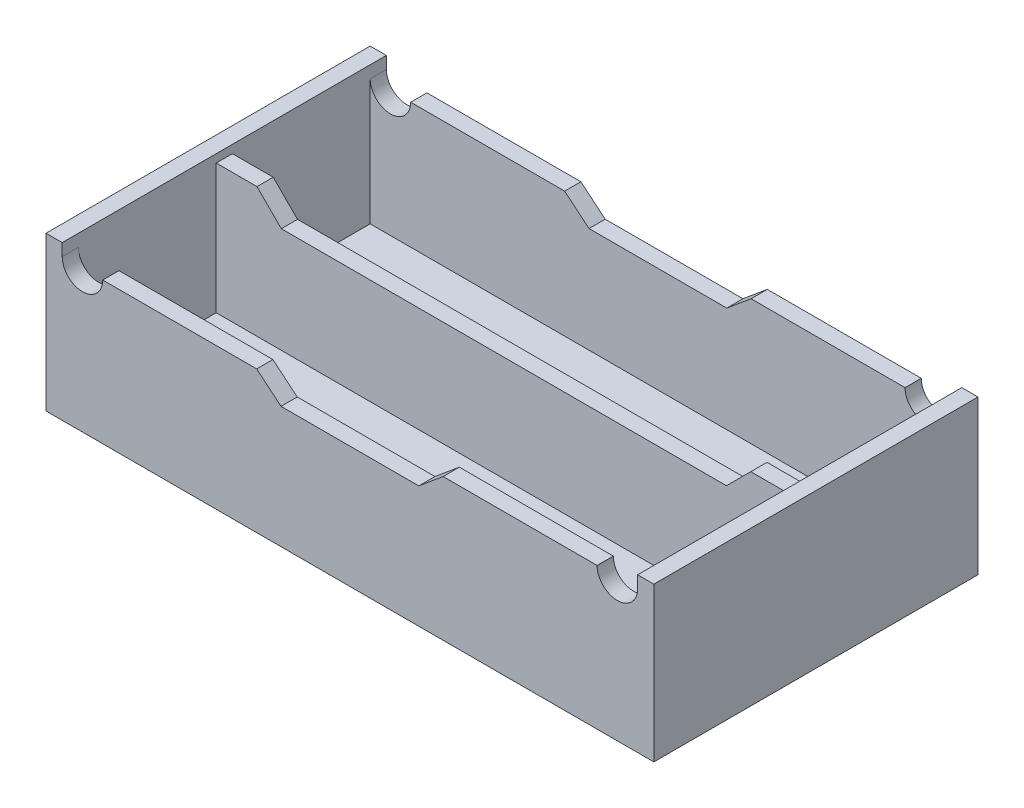
ISO-10303-21;
HEADER;
FILE_DESCRIPTION(('STEP AP214'),'2;1');
FILE_NAME('part.step','',(''),(''),'','','');
FILE_SCHEMA(('AUTOMOTIVE_DESIGN { 1 0 10303 214 1 1 1 1 }'));
ENDSEC;
DATA;
#1=APPLICATION_CONTEXT('core data for automotive mechanical design processes');
#2=APPLICATION_PROTOCOL_DEFINITION('international standard','automotive_design',2000,#1);
#3=PRODUCT_CONTEXT('',#1,'mechanical');
#4=PRODUCT('Part','Part','',(#3));
#5=PRODUCT_RELATED_PRODUCT_CATEGORY('part','',(#4));
#6=PRODUCT_DEFINITION_FORMATION('','',#4);
#7=PRODUCT_DEFINITION_CONTEXT('part definition',#1,'design');
#8=PRODUCT_DEFINITION('design','',#6,#7);
#9=PRODUCT_DEFINITION_SHAPE('','',#8);
#10=(LENGTH_UNIT() NAMED_UNIT(*) SI_UNIT(.MILLI.,.METRE.));
#11=(NAMED_UNIT(*) PLANE_ANGLE_UNIT() SI_UNIT($,.RADIAN.));
#12=(NAMED_UNIT(*) SI_UNIT($,.STERADIAN.) SOLID_ANGLE_UNIT());
#13=UNCERTAINTY_MEASURE_WITH_UNIT(LENGTH_MEASURE(1.E-05),#10,'distance_accuracy_value','');
#14=(GEOMETRIC_REPRESENTATION_CONTEXT(3) GLOBAL_UNCERTAINTY_ASSIGNED_CONTEXT((#13)) GLOBAL_UNIT_ASSIGNED_CONTEXT((#10,
#11,#12)) REPRESENTATION_CONTEXT('',''));
#15=CARTESIAN_POINT('',(0.,0.,0.));
#16=DIRECTION('',(0.,0.,1.));
#17=DIRECTION('',(1.,0.,0.));
#18=AXIS2_PLACEMENT_3D('',#15,#16,#17);
#19=CARTESIAN_POINT('',(0.,19.,0.));
#20=DIRECTION('',(0.,1.,0.));
#21=DIRECTION('',(0.,0.,1.));
#22=AXIS2_PLACEMENT_3D('',#19,#20,#21);
#23=PLANE('',#22);
#24=DIRECTION('',(0.,0.,-1.));
#25=VECTOR('',#24,1.);
#26=CARTESIAN_POINT('',(73.,19.,-38.));
#27=LINE('',#26,#25);
#28=CARTESIAN_POINT('',(73.,19.,0.));
#29=VERTEX_POINT('',#28);
#30=CARTESIAN_POINT('',(73.,19.,-40.));
#31=VERTEX_POINT('',#30);
#32=EDGE_CURVE('E432',#29,#31,#27,.T.);
#33=ORIENTED_EDGE('',*,*,#32,.F.);
#34=DIRECTION('',(1.,0.,0.));
#35=VECTOR('',#34,1.);
#36=CARTESIAN_POINT('',(0.,19.,0.));
#37=LINE('',#36,#35);
#38=CARTESIAN_POINT('',(75.,19.,0.));
#39=VERTEX_POINT('',#38);
#40=EDGE_CURVE('E272',#29,#39,#37,.T.);
#41=ORIENTED_EDGE('',*,*,#40,.T.);
#42=DIRECTION('',(0.,0.,-1.));
#43=VECTOR('',#42,1.);
#44=CARTESIAN_POINT('',(75.,19.,-40.));
#45=LINE('',#44,#43);
#46=CARTESIAN_POINT('',(75.,19.,-40.));
#47=VERTEX_POINT('',#46);
#48=EDGE_CURVE('E281',#39,#47,#45,.T.);
#49=ORIENTED_EDGE('',*,*,#48,.T.);
#50=DIRECTION('',(-1.,0.,0.));
#51=VECTOR('',#50,1.);
#52=CARTESIAN_POINT('',(0.,19.,-40.));
#53=LINE('',#52,#51);
#54=EDGE_CURVE('E285',#47,#31,#53,.T.);
#55=ORIENTED_EDGE('',*,*,#54,.T.);
#56=EDGE_LOOP('',(#33,#41,#49,#55));
#57=FACE_BOUND('',#56,.T.);
#58=ADVANCED_FACE('F33',(#57),#23,.T.);
#59=CARTESIAN_POINT('',(0.,19.,0.));
#60=VERTEX_POINT('',#59);
#61=CARTESIAN_POINT('',(2.,19.,0.));
#62=VERTEX_POINT('',#61);
#63=EDGE_CURVE('E278',#60,#62,#37,.T.);
#64=ORIENTED_EDGE('',*,*,#63,.T.);
#65=DIRECTION('',(0.,0.,1.));
#66=VECTOR('',#65,1.);
#67=CARTESIAN_POINT('',(2.,19.,-38.));
#68=LINE('',#67,#66);
#69=CARTESIAN_POINT('',(2.,19.,-40.));
#70=VERTEX_POINT('',#69);
#71=EDGE_CURVE('E430',#70,#62,#68,.T.);
#72=ORIENTED_EDGE('',*,*,#71,.F.);
#73=CARTESIAN_POINT('',(0.,19.,-40.));
#74=VERTEX_POINT('',#73);
#75=EDGE_CURVE('E284',#70,#74,#53,.T.);
#76=ORIENTED_EDGE('',*,*,#75,.T.);
#77=DIRECTION('',(0.,0.,1.));
#78=VECTOR('',#77,1.);
#79=CARTESIAN_POINT('',(0.,19.,-40.));
#80=LINE('',#79,#78);
#81=EDGE_CURVE('E268',#74,#60,#80,.T.);
#82=ORIENTED_EDGE('',*,*,#81,.T.);
#83=EDGE_LOOP('',(#64,#72,#76,#82));
#84=FACE_BOUND('',#83,.T.);
#85=ADVANCED_FACE('F560',(#84),#23,.T.);
#86=CARTESIAN_POINT('',(0.,2.,-40.));
#87=DIRECTION('',(0.,0.,1.));
#88=DIRECTION('',(1.,0.,0.));
#89=AXIS2_PLACEMENT_3D('',#86,#87,#88);
#90=PLANE('',#89);
#91=CARTESIAN_POINT('',(70.5,17.5,-40.));
#92=DIRECTION('',(0.,0.,1.));
#93=DIRECTION('',(1.,0.,0.));
#94=AXIS2_PLACEMENT_3D('',#91,#92,#93);
#95=CIRCLE('',#94,2.5);
#96=CARTESIAN_POINT('',(68.,17.5,-40.));
#97=VERTEX_POINT('',#96);
#98=CARTESIAN_POINT('',(73.,17.5,-40.));
#99=VERTEX_POINT('',#98);
#100=EDGE_CURVE('E351',#97,#99,#95,.T.);
#101=ORIENTED_EDGE('',*,*,#100,.T.);
#102=DIRECTION('',(0.,-1.,0.));
#103=VECTOR('',#102,1.);
#104=CARTESIAN_POINT('',(73.,19.,-40.));
#105=LINE('',#104,#103);
#106=EDGE_CURVE('E466',#31,#99,#105,.T.);
#107=ORIENTED_EDGE('',*,*,#106,.F.);
#108=ORIENTED_EDGE('',*,*,#54,.F.);
#109=DIRECTION('',(0.,-1.,0.));
#110=VECTOR('',#109,1.);
#111=CARTESIAN_POINT('',(75.,2.,-40.));
#112=LINE('',#111,#110);
#113=CARTESIAN_POINT('',(75.,0.,-40.));
#114=VERTEX_POINT('',#113);
#115=EDGE_CURVE('E300',#47,#114,#112,.T.);
#116=ORIENTED_EDGE('',*,*,#115,.T.);
#117=DIRECTION('',(-1.,0.,0.));
#118=VECTOR('',#117,1.);
#119=CARTESIAN_POINT('',(0.,0.,-40.));
#120=LINE('',#119,#118);
#121=CARTESIAN_POINT('',(0.,0.,-40.));
#122=VERTEX_POINT('',#121);
#123=EDGE_CURVE('E295',#114,#122,#120,.T.);
#124=ORIENTED_EDGE('',*,*,#123,.T.);
#125=DIRECTION('',(0.,-1.,0.));
#126=VECTOR('',#125,1.);
#127=CARTESIAN_POINT('',(0.,2.,-40.));
#128=LINE('',#127,#126);
#129=EDGE_CURVE('E297',#74,#122,#128,.T.);
#130=ORIENTED_EDGE('',*,*,#129,.F.);
#131=ORIENTED_EDGE('',*,*,#75,.F.);
#132=DIRECTION('',(0.,1.,0.));
#133=VECTOR('',#132,1.);
#134=CARTESIAN_POINT('',(2.,17.5,-40.));
#135=LINE('',#134,#133);
#136=CARTESIAN_POINT('',(2.,17.5,-40.));
#137=VERTEX_POINT('',#136);
#138=EDGE_CURVE('E453',#137,#70,#135,.T.);
#139=ORIENTED_EDGE('',*,*,#138,.F.);
#140=CARTESIAN_POINT('',(4.5,17.5,-40.));
#141=DIRECTION('',(0.,0.,1.));
#142=DIRECTION('',(1.,0.,0.));
#143=AXIS2_PLACEMENT_3D('',#140,#141,#142);
#144=CIRCLE('',#143,2.5);
#145=CARTESIAN_POINT('',(7.,17.5,-40.));
#146=VERTEX_POINT('',#145);
#147=EDGE_CURVE('E456',#137,#146,#144,.T.);
#148=ORIENTED_EDGE('',*,*,#147,.T.);
#149=DIRECTION('',(1.,0.,0.));
#150=VECTOR('',#149,1.);
#151=CARTESIAN_POINT('',(7.,17.5,-40.));
#152=LINE('',#151,#150);
#153=CARTESIAN_POINT('',(26.,17.5,-40.));
#154=VERTEX_POINT('',#153);
#155=EDGE_CURVE('E462',#146,#154,#152,.T.);
#156=ORIENTED_EDGE('',*,*,#155,.T.);
#157=DIRECTION('',(0.768221279597376,-0.64018439966448,0.));
#158=VECTOR('',#157,1.);
#159=CARTESIAN_POINT('',(26.,17.5,-40.));
#160=LINE('',#159,#158);
#161=CARTESIAN_POINT('',(29.,15.,-40.));
#162=VERTEX_POINT('',#161);
#163=EDGE_CURVE('E363',#154,#162,#160,.T.);
#164=ORIENTED_EDGE('',*,*,#163,.T.);
#165=DIRECTION('',(1.,0.,0.));
#166=VECTOR('',#165,1.);
#167=CARTESIAN_POINT('',(29.,15.,-40.));
#168=LINE('',#167,#166);
#169=CARTESIAN_POINT('',(46.,15.,-40.));
#170=VERTEX_POINT('',#169);
#171=EDGE_CURVE('E477',#162,#170,#168,.T.);
#172=ORIENTED_EDGE('',*,*,#171,.T.);
#173=DIRECTION('',(0.768221279597376,0.64018439966448,0.));
#174=VECTOR('',#173,1.);
#175=CARTESIAN_POINT('',(46.,15.,-40.));
#176=LINE('',#175,#174);
#177=CARTESIAN_POINT('',(49.,17.5,-40.));
#178=VERTEX_POINT('',#177);
#179=EDGE_CURVE('E474',#170,#178,#176,.T.);
#180=ORIENTED_EDGE('',*,*,#179,.T.);
#181=DIRECTION('',(1.,0.,0.));
#182=VECTOR('',#181,1.);
#183=CARTESIAN_POINT('',(49.,17.5,-40.));
#184=LINE('',#183,#182);
#185=EDGE_CURVE('E472',#178,#97,#184,.T.);
#186=ORIENTED_EDGE('',*,*,#185,.T.);
#187=EDGE_LOOP('',(#101,#107,#108,#116,#124,#130,#131,#139,#148,#156,#164,#172,#180,#186));
#188=FACE_BOUND('',#187,.T.);
#189=ADVANCED_FACE('F464',(#188),#90,.F.);
#190=CARTESIAN_POINT('',(0.,2.,0.));
#191=DIRECTION('',(0.,0.,-1.));
#192=DIRECTION('',(-1.,0.,0.));
#193=AXIS2_PLACEMENT_3D('',#190,#191,#192);
#194=PLANE('',#193);
#195=DIRECTION('',(0.,1.,0.));
#196=VECTOR('',#195,1.);
#197=CARTESIAN_POINT('',(2.,17.5,0.));
#198=LINE('',#197,#196);
#199=CARTESIAN_POINT('',(2.,17.5,0.));
#200=VERTEX_POINT('',#199);
#201=EDGE_CURVE('E386',#200,#62,#198,.T.);
#202=ORIENTED_EDGE('',*,*,#201,.T.);
#203=ORIENTED_EDGE('',*,*,#63,.F.);
#204=DIRECTION('',(0.,-1.,0.));
#205=VECTOR('',#204,1.);
#206=CARTESIAN_POINT('',(0.,2.,0.));
#207=LINE('',#206,#205);
#208=CARTESIAN_POINT('',(0.,0.,0.));
#209=VERTEX_POINT('',#208);
#210=EDGE_CURVE('E306',#60,#209,#207,.T.);
#211=ORIENTED_EDGE('',*,*,#210,.T.);
#212=DIRECTION('',(1.,0.,0.));
#213=VECTOR('',#212,1.);
#214=CARTESIAN_POINT('',(0.,0.,0.));
#215=LINE('',#214,#213);
#216=CARTESIAN_POINT('',(75.,0.,0.));
#217=VERTEX_POINT('',#216);
#218=EDGE_CURVE('E291',#209,#217,#215,.T.);
#219=ORIENTED_EDGE('',*,*,#218,.T.);
#220=DIRECTION('',(0.,-1.,0.));
#221=VECTOR('',#220,1.);
#222=CARTESIAN_POINT('',(75.,2.,0.));
#223=LINE('',#222,#221);
#224=EDGE_CURVE('E303',#39,#217,#223,.T.);
#225=ORIENTED_EDGE('',*,*,#224,.F.);
#226=ORIENTED_EDGE('',*,*,#40,.F.);
#227=DIRECTION('',(0.,-1.,0.));
#228=VECTOR('',#227,1.);
#229=CARTESIAN_POINT('',(73.,19.,0.));
#230=LINE('',#229,#228);
#231=CARTESIAN_POINT('',(73.,17.5,0.));
#232=VERTEX_POINT('',#231);
#233=EDGE_CURVE('E383',#29,#232,#230,.T.);
#234=ORIENTED_EDGE('',*,*,#233,.T.);
#235=CARTESIAN_POINT('',(70.5,17.5,0.));
#236=DIRECTION('',(0.,0.,1.));
#237=DIRECTION('',(1.,0.,0.));
#238=AXIS2_PLACEMENT_3D('',#235,#236,#237);
#239=CIRCLE('',#238,2.5);
#240=CARTESIAN_POINT('',(68.,17.5,0.));
#241=VERTEX_POINT('',#240);
#242=EDGE_CURVE('E380',#241,#232,#239,.T.);
#243=ORIENTED_EDGE('',*,*,#242,.F.);
#244=DIRECTION('',(1.,0.,0.));
#245=VECTOR('',#244,1.);
#246=CARTESIAN_POINT('',(49.,17.5,0.));
#247=LINE('',#246,#245);
#248=CARTESIAN_POINT('',(49.,17.5,0.));
#249=VERTEX_POINT('',#248);
#250=EDGE_CURVE('E377',#249,#241,#247,.T.);
#251=ORIENTED_EDGE('',*,*,#250,.F.);
#252=DIRECTION('',(0.768221279597376,0.64018439966448,0.));
#253=VECTOR('',#252,1.);
#254=CARTESIAN_POINT('',(46.,15.,0.));
#255=LINE('',#254,#253);
#256=CARTESIAN_POINT('',(46.,15.,0.));
#257=VERTEX_POINT('',#256);
#258=EDGE_CURVE('E374',#257,#249,#255,.T.);
#259=ORIENTED_EDGE('',*,*,#258,.F.);
#260=DIRECTION('',(1.,0.,0.));
#261=VECTOR('',#260,1.);
#262=CARTESIAN_POINT('',(29.,15.,0.));
#263=LINE('',#262,#261);
#264=CARTESIAN_POINT('',(29.,15.,0.));
#265=VERTEX_POINT('',#264);
#266=EDGE_CURVE('E371',#265,#257,#263,.T.);
#267=ORIENTED_EDGE('',*,*,#266,.F.);
#268=DIRECTION('',(0.768221279597376,-0.64018439966448,0.));
#269=VECTOR('',#268,1.);
#270=CARTESIAN_POINT('',(26.,17.5,0.));
#271=LINE('',#270,#269);
#272=CARTESIAN_POINT('',(26.,17.5,0.));
#273=VERTEX_POINT('',#272);
#274=EDGE_CURVE('E367',#273,#265,#271,.T.);
#275=ORIENTED_EDGE('',*,*,#274,.F.);
#276=DIRECTION('',(1.,0.,0.));
#277=VECTOR('',#276,1.);
#278=CARTESIAN_POINT('',(7.,17.5,0.));
#279=LINE('',#278,#277);
#280=CARTESIAN_POINT('',(7.,17.5,0.));
#281=VERTEX_POINT('',#280);
#282=EDGE_CURVE('E364',#281,#273,#279,.T.);
#283=ORIENTED_EDGE('',*,*,#282,.F.);
#284=CARTESIAN_POINT('',(4.5,17.5,0.));
#285=DIRECTION('',(0.,0.,1.));
#286=DIRECTION('',(1.,0.,0.));
#287=AXIS2_PLACEMENT_3D('',#284,#285,#286);
#288=CIRCLE('',#287,2.5);
#289=EDGE_CURVE('E389',#200,#281,#288,.T.);
#290=ORIENTED_EDGE('',*,*,#289,.F.);
#291=EDGE_LOOP('',(#202,#203,#211,#219,#225,#226,#234,#243,#251,#259,#267,#275,#283,#290));
#292=FACE_BOUND('',#291,.T.);
#293=ADVANCED_FACE('F666',(#292),#194,.F.);
#294=CARTESIAN_POINT('',(0.,2.,0.));
#295=DIRECTION('',(1.,0.,0.));
#296=DIRECTION('',(0.,0.,-1.));
#297=AXIS2_PLACEMENT_3D('',#294,#295,#296);
#298=PLANE('',#297);
#299=DIRECTION('',(0.,0.,1.));
#300=VECTOR('',#299,1.);
#301=CARTESIAN_POINT('',(0.,0.,0.));
#302=LINE('',#301,#300);
#303=EDGE_CURVE('E288',#122,#209,#302,.T.);
#304=ORIENTED_EDGE('',*,*,#303,.T.);
#305=ORIENTED_EDGE('',*,*,#210,.F.);
#306=ORIENTED_EDGE('',*,*,#81,.F.);
#307=ORIENTED_EDGE('',*,*,#129,.T.);
#308=EDGE_LOOP('',(#304,#305,#306,#307));
#309=FACE_BOUND('',#308,.T.);
#310=ADVANCED_FACE('F35',(#309),#298,.F.);
#311=CARTESIAN_POINT('',(75.,2.,0.));
#312=DIRECTION('',(-1.,0.,0.));
#313=DIRECTION('',(0.,0.,1.));
#314=AXIS2_PLACEMENT_3D('',#311,#312,#313);
#315=PLANE('',#314);
#316=DIRECTION('',(0.,0.,-1.));
#317=VECTOR('',#316,1.);
#318=CARTESIAN_POINT('',(75.,0.,0.));
#319=LINE('',#318,#317);
#320=EDGE_CURVE('E293',#217,#114,#319,.T.);
#321=ORIENTED_EDGE('',*,*,#320,.T.);
#322=ORIENTED_EDGE('',*,*,#115,.F.);
#323=ORIENTED_EDGE('',*,*,#48,.F.);
#324=ORIENTED_EDGE('',*,*,#224,.T.);
#325=EDGE_LOOP('',(#321,#322,#323,#324));
#326=FACE_BOUND('',#325,.T.);
#327=ADVANCED_FACE('F649',(#326),#315,.F.);
#328=CARTESIAN_POINT('',(0.,0.,0.));
#329=DIRECTION('',(0.,-1.,0.));
#330=DIRECTION('',(0.,0.,-1.));
#331=AXIS2_PLACEMENT_3D('',#328,#329,#330);
#332=PLANE('',#331);
#333=CARTESIAN_POINT('',(37.5,0.,-29.5));
#334=DIRECTION('',(0.,-1.,0.));
#335=DIRECTION('',(0.,0.,-1.));
#336=AXIS2_PLACEMENT_3D('',#333,#334,#335);
#337=CIRCLE('',#336,1.6);
#338=CARTESIAN_POINT('',(37.5,0.,-31.1));
#339=VERTEX_POINT('',#338);
#340=EDGE_CURVE('E535',#339,#339,#337,.F.);
#341=ORIENTED_EDGE('',*,*,#340,.T.);
#342=EDGE_LOOP('',(#341));
#343=FACE_BOUND('',#342,.T.);
#344=CARTESIAN_POINT('',(37.5,0.,-10.5));
#345=DIRECTION('',(0.,-1.,0.));
#346=DIRECTION('',(0.,0.,-1.));
#347=AXIS2_PLACEMENT_3D('',#344,#345,#346);
#348=CIRCLE('',#347,1.6);
#349=CARTESIAN_POINT('',(37.5,0.,-12.1));
#350=VERTEX_POINT('',#349);
#351=EDGE_CURVE('E529',#350,#350,#348,.F.);
#352=ORIENTED_EDGE('',*,*,#351,.T.);
#353=EDGE_LOOP('',(#352));
#354=FACE_BOUND('',#353,.T.);
#355=ORIENTED_EDGE('',*,*,#303,.F.);
#356=ORIENTED_EDGE('',*,*,#123,.F.);
#357=ORIENTED_EDGE('',*,*,#320,.F.);
#358=ORIENTED_EDGE('',*,*,#218,.F.);
#359=EDGE_LOOP('',(#355,#356,#357,#358));
#360=FACE_BOUND('',#359,.T.);
#361=ADVANCED_FACE('F569',(#343,#354,#360),#332,.T.);
#362=CARTESIAN_POINT('',(2.,19.,-38.));
#363=DIRECTION('',(1.,0.,0.));
#364=DIRECTION('',(0.,0.,-1.));
#365=AXIS2_PLACEMENT_3D('',#362,#363,#364);
#366=PLANE('',#365);
#367=DIRECTION('',(0.,-1.,0.));
#368=VECTOR('',#367,1.);
#369=CARTESIAN_POINT('',(2.,19.,-38.));
#370=LINE('',#369,#368);
#371=CARTESIAN_POINT('',(2.,17.5,-38.));
#372=VERTEX_POINT('',#371);
#373=CARTESIAN_POINT('',(2.,2.,-38.));
#374=VERTEX_POINT('',#373);
#375=EDGE_CURVE('E435',#372,#374,#370,.T.);
#376=ORIENTED_EDGE('',*,*,#375,.F.);
#377=DIRECTION('',(0.,0.,-1.));
#378=VECTOR('',#377,1.);
#379=CARTESIAN_POINT('',(2.,17.5,-23.));
#380=LINE('',#379,#378);
#381=EDGE_CURVE('E56',#372,#137,#380,.T.);
#382=ORIENTED_EDGE('',*,*,#381,.T.);
#383=ORIENTED_EDGE('',*,*,#138,.T.);
#384=ORIENTED_EDGE('',*,*,#71,.T.);
#385=ORIENTED_EDGE('',*,*,#201,.F.);
#386=DIRECTION('',(0.,0.,1.));
#387=VECTOR('',#386,1.);
#388=CARTESIAN_POINT('',(2.,17.5,-17.));
#389=LINE('',#388,#387);
#390=CARTESIAN_POINT('',(2.,17.5,-2.));
#391=VERTEX_POINT('',#390);
#392=EDGE_CURVE('E396',#391,#200,#389,.T.);
#393=ORIENTED_EDGE('',*,*,#392,.F.);
#394=DIRECTION('',(0.,-1.,0.));
#395=VECTOR('',#394,1.);
#396=CARTESIAN_POINT('',(2.,19.,-2.));
#397=LINE('',#396,#395);
#398=CARTESIAN_POINT('',(2.,2.,-2.));
#399=VERTEX_POINT('',#398);
#400=EDGE_CURVE('E427',#391,#399,#397,.T.);
#401=ORIENTED_EDGE('',*,*,#400,.T.);
#402=DIRECTION('',(0.,0.,1.));
#403=VECTOR('',#402,1.);
#404=CARTESIAN_POINT('',(2.,2.,-19.));
#405=LINE('',#404,#403);
#406=CARTESIAN_POINT('',(2.,2.,-19.));
#407=VERTEX_POINT('',#406);
#408=EDGE_CURVE('E410',#407,#399,#405,.T.);
#409=ORIENTED_EDGE('',*,*,#408,.F.);
#410=DIRECTION('',(0.,-1.,0.));
#411=VECTOR('',#410,1.);
#412=CARTESIAN_POINT('',(2.,19.,-19.));
#413=LINE('',#412,#411);
#414=CARTESIAN_POINT('',(2.,18.,-19.));
#415=VERTEX_POINT('',#414);
#416=EDGE_CURVE('E259',#415,#407,#413,.T.);
#417=ORIENTED_EDGE('',*,*,#416,.F.);
#418=DIRECTION('',(0.,0.,1.));
#419=VECTOR('',#418,1.);
#420=CARTESIAN_POINT('',(2.,18.,-40.001));
#421=LINE('',#420,#419);
#422=CARTESIAN_POINT('',(2.,18.,-21.));
#423=VERTEX_POINT('',#422);
#424=EDGE_CURVE('E48',#423,#415,#421,.T.);
#425=ORIENTED_EDGE('',*,*,#424,.F.);
#426=DIRECTION('',(0.,-1.,0.));
#427=VECTOR('',#426,1.);
#428=CARTESIAN_POINT('',(2.,19.,-21.));
#429=LINE('',#428,#427);
#430=CARTESIAN_POINT('',(2.,2.,-21.));
#431=VERTEX_POINT('',#430);
#432=EDGE_CURVE('E256',#423,#431,#429,.T.);
#433=ORIENTED_EDGE('',*,*,#432,.T.);
#434=DIRECTION('',(0.,0.,1.));
#435=VECTOR('',#434,1.);
#436=CARTESIAN_POINT('',(2.,2.,-38.));
#437=LINE('',#436,#435);
#438=EDGE_CURVE('E429',#374,#431,#437,.T.);
#439=ORIENTED_EDGE('',*,*,#438,.F.);
#440=EDGE_LOOP('',(#376,#382,#383,#384,#385,#393,#401,#409,#417,#425,#433,#439));
#441=FACE_BOUND('',#440,.T.);
#442=ADVANCED_FACE('F254',(#441),#366,.T.);
#443=CARTESIAN_POINT('',(2.,19.,-21.));
#444=DIRECTION('',(0.,0.,-1.));
#445=DIRECTION('',(-1.,0.,0.));
#446=AXIS2_PLACEMENT_3D('',#443,#444,#445);
#447=PLANE('',#446);
#448=DIRECTION('',(1.,0.,0.));
#449=VECTOR('',#448,1.);
#450=CARTESIAN_POINT('',(67.9640816590571,18.,-21.));
#451=LINE('',#450,#449);
#452=CARTESIAN_POINT('',(67.9640816590571,18.,-21.));
#453=VERTEX_POINT('',#452);
#454=CARTESIAN_POINT('',(73.,18.,-21.));
#455=VERTEX_POINT('',#454);
#456=EDGE_CURVE('E249',#453,#455,#451,.T.);
#457=ORIENTED_EDGE('',*,*,#456,.T.);
#458=DIRECTION('',(0.,-1.,0.));
#459=VECTOR('',#458,1.);
#460=CARTESIAN_POINT('',(73.,19.,-21.));
#461=LINE('',#460,#459);
#462=CARTESIAN_POINT('',(73.,2.,-21.));
#463=VERTEX_POINT('',#462);
#464=EDGE_CURVE('E269',#455,#463,#461,.T.);
#465=ORIENTED_EDGE('',*,*,#464,.T.);
#466=DIRECTION('',(1.,0.,0.));
#467=VECTOR('',#466,1.);
#468=CARTESIAN_POINT('',(2.,2.,-21.));
#469=LINE('',#468,#467);
#470=EDGE_CURVE('E266',#431,#463,#469,.T.);
#471=ORIENTED_EDGE('',*,*,#470,.F.);
#472=ORIENTED_EDGE('',*,*,#432,.F.);
#473=DIRECTION('',(1.,0.,0.));
#474=VECTOR('',#473,1.);
#475=CARTESIAN_POINT('',(2.,18.,-21.));
#476=LINE('',#475,#474);
#477=CARTESIAN_POINT('',(7.03591834094287,18.,-21.));
#478=VERTEX_POINT('',#477);
#479=EDGE_CURVE('E242',#423,#478,#476,.T.);
#480=ORIENTED_EDGE('',*,*,#479,.T.);
#481=DIRECTION('',(0.707106781186547,-0.707106781186548,0.));
#482=VECTOR('',#481,1.);
#483=CARTESIAN_POINT('',(7.03591834094287,18.,-21.));
#484=LINE('',#483,#482);
#485=CARTESIAN_POINT('',(10.0359183409429,15.,-21.));
#486=VERTEX_POINT('',#485);
#487=EDGE_CURVE('E260',#478,#486,#484,.T.);
#488=ORIENTED_EDGE('',*,*,#487,.T.);
#489=DIRECTION('',(1.,0.,0.));
#490=VECTOR('',#489,1.);
#491=CARTESIAN_POINT('',(10.0359183409429,15.,-21.));
#492=LINE('',#491,#490);
#493=CARTESIAN_POINT('',(64.9640816590571,15.,-21.));
#494=VERTEX_POINT('',#493);
#495=EDGE_CURVE('E525',#486,#494,#492,.T.);
#496=ORIENTED_EDGE('',*,*,#495,.T.);
#497=DIRECTION('',(0.707106781186548,0.707106781186547,0.));
#498=VECTOR('',#497,1.);
#499=CARTESIAN_POINT('',(64.9640816590571,15.,-21.));
#500=LINE('',#499,#498);
#501=EDGE_CURVE('E522',#494,#453,#500,.T.);
#502=ORIENTED_EDGE('',*,*,#501,.T.);
#503=EDGE_LOOP('',(#457,#465,#471,#472,#480,#488,#496,#502));
#504=FACE_BOUND('',#503,.T.);
#505=ADVANCED_FACE('F264',(#504),#447,.T.);
#506=CARTESIAN_POINT('',(73.,19.,-38.));
#507=DIRECTION('',(-1.,0.,0.));
#508=DIRECTION('',(0.,0.,1.));
#509=AXIS2_PLACEMENT_3D('',#506,#507,#508);
#510=PLANE('',#509);
#511=DIRECTION('',(0.,0.,-1.));
#512=VECTOR('',#511,1.);
#513=CARTESIAN_POINT('',(73.,17.5,-23.));
#514=LINE('',#513,#512);
#515=CARTESIAN_POINT('',(73.,17.5,-38.));
#516=VERTEX_POINT('',#515);
#517=EDGE_CURVE('E353',#516,#99,#514,.T.);
#518=ORIENTED_EDGE('',*,*,#517,.F.);
#519=DIRECTION('',(0.,-1.,0.));
#520=VECTOR('',#519,1.);
#521=CARTESIAN_POINT('',(73.,19.,-38.));
#522=LINE('',#521,#520);
#523=CARTESIAN_POINT('',(73.,2.,-38.));
#524=VERTEX_POINT('',#523);
#525=EDGE_CURVE('E274',#516,#524,#522,.T.);
#526=ORIENTED_EDGE('',*,*,#525,.T.);
#527=DIRECTION('',(0.,0.,-1.));
#528=VECTOR('',#527,1.);
#529=CARTESIAN_POINT('',(73.,2.,-38.));
#530=LINE('',#529,#528);
#531=EDGE_CURVE('E438',#463,#524,#530,.T.);
#532=ORIENTED_EDGE('',*,*,#531,.F.);
#533=ORIENTED_EDGE('',*,*,#464,.F.);
#534=DIRECTION('',(0.,0.,1.));
#535=VECTOR('',#534,1.);
#536=CARTESIAN_POINT('',(73.,18.,-40.001));
#537=LINE('',#536,#535);
#538=CARTESIAN_POINT('',(73.,18.,-19.));
#539=VERTEX_POINT('',#538);
#540=EDGE_CURVE('E261',#455,#539,#537,.T.);
#541=ORIENTED_EDGE('',*,*,#540,.T.);
#542=DIRECTION('',(0.,-1.,0.));
#543=VECTOR('',#542,1.);
#544=CARTESIAN_POINT('',(73.,19.,-19.));
#545=LINE('',#544,#543);
#546=CARTESIAN_POINT('',(73.,2.,-19.));
#547=VERTEX_POINT('',#546);
#548=EDGE_CURVE('E423',#539,#547,#545,.T.);
#549=ORIENTED_EDGE('',*,*,#548,.T.);
#550=DIRECTION('',(0.,0.,-1.));
#551=VECTOR('',#550,1.);
#552=CARTESIAN_POINT('',(73.,2.,-19.));
#553=LINE('',#552,#551);
#554=CARTESIAN_POINT('',(73.,2.,-2.));
#555=VERTEX_POINT('',#554);
#556=EDGE_CURVE('E416',#555,#547,#553,.T.);
#557=ORIENTED_EDGE('',*,*,#556,.F.);
#558=DIRECTION('',(0.,-1.,0.));
#559=VECTOR('',#558,1.);
#560=CARTESIAN_POINT('',(73.,19.,-2.));
#561=LINE('',#560,#559);
#562=CARTESIAN_POINT('',(73.,17.5,-2.));
#563=VERTEX_POINT('',#562);
#564=EDGE_CURVE('E425',#563,#555,#561,.T.);
#565=ORIENTED_EDGE('',*,*,#564,.F.);
#566=DIRECTION('',(0.,0.,1.));
#567=VECTOR('',#566,1.);
#568=CARTESIAN_POINT('',(73.,17.5,-17.));
#569=LINE('',#568,#567);
#570=EDGE_CURVE('E398',#563,#232,#569,.T.);
#571=ORIENTED_EDGE('',*,*,#570,.T.);
#572=ORIENTED_EDGE('',*,*,#233,.F.);
#573=ORIENTED_EDGE('',*,*,#32,.T.);
#574=ORIENTED_EDGE('',*,*,#106,.T.);
#575=EDGE_LOOP('',(#518,#526,#532,#533,#541,#549,#557,#565,#571,#572,#573,#574));
#576=FACE_BOUND('',#575,.T.);
#577=ADVANCED_FACE('F446',(#576),#510,.T.);
#578=CARTESIAN_POINT('',(2.,19.,-38.));
#579=DIRECTION('',(0.,0.,1.));
#580=DIRECTION('',(1.,0.,0.));
#581=AXIS2_PLACEMENT_3D('',#578,#579,#580);
#582=PLANE('',#581);
#583=ORIENTED_EDGE('',*,*,#525,.F.);
#584=CARTESIAN_POINT('',(70.5,17.5,-38.));
#585=DIRECTION('',(0.,0.,1.));
#586=DIRECTION('',(1.,0.,0.));
#587=AXIS2_PLACEMENT_3D('',#584,#585,#586);
#588=CIRCLE('',#587,2.5);
#589=CARTESIAN_POINT('',(68.,17.5,-38.));
#590=VERTEX_POINT('',#589);
#591=EDGE_CURVE('E11',#516,#590,#588,.F.);
#592=ORIENTED_EDGE('',*,*,#591,.T.);
#593=DIRECTION('',(-1.,0.,0.));
#594=VECTOR('',#593,1.);
#595=CARTESIAN_POINT('',(2.,17.5,-38.));
#596=LINE('',#595,#594);
#597=CARTESIAN_POINT('',(49.,17.5,-38.));
#598=VERTEX_POINT('',#597);
#599=EDGE_CURVE('E41',#590,#598,#596,.T.);
#600=ORIENTED_EDGE('',*,*,#599,.T.);
#601=DIRECTION('',(-0.768221279597376,-0.64018439966448,0.));
#602=VECTOR('',#601,1.);
#603=CARTESIAN_POINT('',(22.,-5.,-38.));
#604=LINE('',#603,#602);
#605=CARTESIAN_POINT('',(46.,15.,-38.));
#606=VERTEX_POINT('',#605);
#607=EDGE_CURVE('E333',#598,#606,#604,.T.);
#608=ORIENTED_EDGE('',*,*,#607,.T.);
#609=DIRECTION('',(-1.,0.,0.));
#610=VECTOR('',#609,1.);
#611=CARTESIAN_POINT('',(2.,15.,-38.));
#612=LINE('',#611,#610);
#613=CARTESIAN_POINT('',(29.,15.,-38.));
#614=VERTEX_POINT('',#613);
#615=EDGE_CURVE('E330',#606,#614,#612,.T.);
#616=ORIENTED_EDGE('',*,*,#615,.T.);
#617=DIRECTION('',(-0.768221279597376,0.64018439966448,0.));
#618=VECTOR('',#617,1.);
#619=CARTESIAN_POINT('',(11.0983606557377,29.9180327868852,-38.));
#620=LINE('',#619,#618);
#621=CARTESIAN_POINT('',(26.,17.5,-38.));
#622=VERTEX_POINT('',#621);
#623=EDGE_CURVE('E327',#614,#622,#620,.T.);
#624=ORIENTED_EDGE('',*,*,#623,.T.);
#625=DIRECTION('',(-1.,0.,0.));
#626=VECTOR('',#625,1.);
#627=CARTESIAN_POINT('',(2.,17.5,-38.));
#628=LINE('',#627,#626);
#629=CARTESIAN_POINT('',(7.,17.5,-38.));
#630=VERTEX_POINT('',#629);
#631=EDGE_CURVE('E324',#622,#630,#628,.T.);
#632=ORIENTED_EDGE('',*,*,#631,.T.);
#633=CARTESIAN_POINT('',(4.5,17.5,-38.));
#634=DIRECTION('',(0.,0.,1.));
#635=DIRECTION('',(1.,0.,0.));
#636=AXIS2_PLACEMENT_3D('',#633,#634,#635);
#637=CIRCLE('',#636,2.5);
#638=EDGE_CURVE('E322',#630,#372,#637,.F.);
#639=ORIENTED_EDGE('',*,*,#638,.T.);
#640=ORIENTED_EDGE('',*,*,#375,.T.);
#641=DIRECTION('',(-1.,0.,0.));
#642=VECTOR('',#641,1.);
#643=CARTESIAN_POINT('',(2.,2.,-38.));
#644=LINE('',#643,#642);
#645=EDGE_CURVE('E433',#524,#374,#644,.T.);
#646=ORIENTED_EDGE('',*,*,#645,.F.);
#647=EDGE_LOOP('',(#583,#592,#600,#608,#616,#624,#632,#639,#640,#646));
#648=FACE_BOUND('',#647,.T.);
#649=ADVANCED_FACE('F338',(#648),#582,.T.);
#650=CARTESIAN_POINT('',(2.,19.,-2.));
#651=DIRECTION('',(0.,0.,-1.));
#652=DIRECTION('',(-1.,0.,0.));
#653=AXIS2_PLACEMENT_3D('',#650,#651,#652);
#654=PLANE('',#653);
#655=CARTESIAN_POINT('',(4.5,17.5,-2.));
#656=DIRECTION('',(0.,0.,-1.));
#657=DIRECTION('',(-1.,0.,0.));
#658=AXIS2_PLACEMENT_3D('',#655,#656,#657);
#659=CIRCLE('',#658,2.5);
#660=CARTESIAN_POINT('',(7.,17.5,-2.));
#661=VERTEX_POINT('',#660);
#662=EDGE_CURVE('E320',#661,#391,#659,.T.);
#663=ORIENTED_EDGE('',*,*,#662,.F.);
#664=DIRECTION('',(-1.,0.,0.));
#665=VECTOR('',#664,1.);
#666=CARTESIAN_POINT('',(2.,17.5,-2.));
#667=LINE('',#666,#665);
#668=CARTESIAN_POINT('',(26.,17.5,-2.));
#669=VERTEX_POINT('',#668);
#670=EDGE_CURVE('E318',#669,#661,#667,.T.);
#671=ORIENTED_EDGE('',*,*,#670,.F.);
#672=DIRECTION('',(-0.768221279597376,0.64018439966448,0.));
#673=VECTOR('',#672,1.);
#674=CARTESIAN_POINT('',(11.0983606557377,29.9180327868852,-2.));
#675=LINE('',#674,#673);
#676=CARTESIAN_POINT('',(29.,15.,-2.));
#677=VERTEX_POINT('',#676);
#678=EDGE_CURVE('E309',#677,#669,#675,.T.);
#679=ORIENTED_EDGE('',*,*,#678,.F.);
#680=DIRECTION('',(-1.,0.,0.));
#681=VECTOR('',#680,1.);
#682=CARTESIAN_POINT('',(2.,15.,-2.));
#683=LINE('',#682,#681);
#684=CARTESIAN_POINT('',(46.,15.,-2.));
#685=VERTEX_POINT('',#684);
#686=EDGE_CURVE('E311',#685,#677,#683,.T.);
#687=ORIENTED_EDGE('',*,*,#686,.F.);
#688=DIRECTION('',(-0.768221279597376,-0.64018439966448,0.));
#689=VECTOR('',#688,1.);
#690=CARTESIAN_POINT('',(22.,-5.,-2.));
#691=LINE('',#690,#689);
#692=CARTESIAN_POINT('',(49.,17.5,-2.));
#693=VERTEX_POINT('',#692);
#694=EDGE_CURVE('E314',#693,#685,#691,.T.);
#695=ORIENTED_EDGE('',*,*,#694,.F.);
#696=DIRECTION('',(-1.,0.,0.));
#697=VECTOR('',#696,1.);
#698=CARTESIAN_POINT('',(2.,17.5,-2.));
#699=LINE('',#698,#697);
#700=CARTESIAN_POINT('',(68.,17.5,-2.));
#701=VERTEX_POINT('',#700);
#702=EDGE_CURVE('E316',#701,#693,#699,.T.);
#703=ORIENTED_EDGE('',*,*,#702,.F.);
#704=CARTESIAN_POINT('',(70.5,17.5,-2.));
#705=DIRECTION('',(0.,0.,-1.));
#706=DIRECTION('',(-1.,0.,0.));
#707=AXIS2_PLACEMENT_3D('',#704,#705,#706);
#708=CIRCLE('',#707,2.5);
#709=EDGE_CURVE('E395',#563,#701,#708,.T.);
#710=ORIENTED_EDGE('',*,*,#709,.F.);
#711=ORIENTED_EDGE('',*,*,#564,.T.);
#712=DIRECTION('',(1.,0.,0.));
#713=VECTOR('',#712,1.);
#714=CARTESIAN_POINT('',(2.,2.,-2.));
#715=LINE('',#714,#713);
#716=EDGE_CURVE('E413',#399,#555,#715,.T.);
#717=ORIENTED_EDGE('',*,*,#716,.F.);
#718=ORIENTED_EDGE('',*,*,#400,.F.);
#719=EDGE_LOOP('',(#663,#671,#679,#687,#695,#703,#710,#711,#717,#718));
#720=FACE_BOUND('',#719,.T.);
#721=ADVANCED_FACE('F554',(#720),#654,.T.);
#722=CARTESIAN_POINT('',(2.,19.,-19.));
#723=DIRECTION('',(0.,0.,1.));
#724=DIRECTION('',(1.,0.,0.));
#725=AXIS2_PLACEMENT_3D('',#722,#723,#724);
#726=PLANE('',#725);
#727=DIRECTION('',(1.,0.,0.));
#728=VECTOR('',#727,1.);
#729=CARTESIAN_POINT('',(67.9640816590571,18.,-19.));
#730=LINE('',#729,#728);
#731=CARTESIAN_POINT('',(67.9640816590571,18.,-19.));
#732=VERTEX_POINT('',#731);
#733=EDGE_CURVE('E502',#732,#539,#730,.T.);
#734=ORIENTED_EDGE('',*,*,#733,.F.);
#735=DIRECTION('',(0.707106781186548,0.707106781186547,0.));
#736=VECTOR('',#735,1.);
#737=CARTESIAN_POINT('',(64.9640816590571,15.,-19.));
#738=LINE('',#737,#736);
#739=CARTESIAN_POINT('',(64.9640816590571,15.,-19.));
#740=VERTEX_POINT('',#739);
#741=EDGE_CURVE('E511',#740,#732,#738,.T.);
#742=ORIENTED_EDGE('',*,*,#741,.F.);
#743=DIRECTION('',(1.,0.,0.));
#744=VECTOR('',#743,1.);
#745=CARTESIAN_POINT('',(10.0359183409429,15.,-19.));
#746=LINE('',#745,#744);
#747=CARTESIAN_POINT('',(10.0359183409429,15.,-19.));
#748=VERTEX_POINT('',#747);
#749=EDGE_CURVE('E514',#748,#740,#746,.T.);
#750=ORIENTED_EDGE('',*,*,#749,.F.);
#751=DIRECTION('',(0.707106781186547,-0.707106781186548,0.));
#752=VECTOR('',#751,1.);
#753=CARTESIAN_POINT('',(7.03591834094287,18.,-19.));
#754=LINE('',#753,#752);
#755=CARTESIAN_POINT('',(7.03591834094287,18.,-19.));
#756=VERTEX_POINT('',#755);
#757=EDGE_CURVE('E517',#756,#748,#754,.T.);
#758=ORIENTED_EDGE('',*,*,#757,.F.);
#759=DIRECTION('',(1.,0.,0.));
#760=VECTOR('',#759,1.);
#761=CARTESIAN_POINT('',(2.,18.,-19.));
#762=LINE('',#761,#760);
#763=EDGE_CURVE('E248',#415,#756,#762,.T.);
#764=ORIENTED_EDGE('',*,*,#763,.F.);
#765=ORIENTED_EDGE('',*,*,#416,.T.);
#766=DIRECTION('',(-1.,0.,0.));
#767=VECTOR('',#766,1.);
#768=CARTESIAN_POINT('',(2.,2.,-19.));
#769=LINE('',#768,#767);
#770=EDGE_CURVE('E419',#547,#407,#769,.T.);
#771=ORIENTED_EDGE('',*,*,#770,.F.);
#772=ORIENTED_EDGE('',*,*,#548,.F.);
#773=EDGE_LOOP('',(#734,#742,#750,#758,#764,#765,#771,#772));
#774=FACE_BOUND('',#773,.T.);
#775=ADVANCED_FACE('F545',(#774),#726,.T.);
#776=CARTESIAN_POINT('',(0.,2.,0.));
#777=DIRECTION('',(0.,-1.,0.));
#778=DIRECTION('',(0.,0.,-1.));
#779=AXIS2_PLACEMENT_3D('',#776,#777,#778);
#780=PLANE('',#779);
#781=CARTESIAN_POINT('',(37.5,2.,-29.5));
#782=DIRECTION('',(0.,1.,0.));
#783=DIRECTION('',(0.,0.,1.));
#784=AXIS2_PLACEMENT_3D('',#781,#782,#783);
#785=CIRCLE('',#784,1.6);
#786=CARTESIAN_POINT('',(37.5,2.,-27.9));
#787=VERTEX_POINT('',#786);
#788=EDGE_CURVE('E528',#787,#787,#785,.T.);
#789=ORIENTED_EDGE('',*,*,#788,.F.);
#790=EDGE_LOOP('',(#789));
#791=FACE_BOUND('',#790,.T.);
#792=ORIENTED_EDGE('',*,*,#645,.T.);
#793=ORIENTED_EDGE('',*,*,#438,.T.);
#794=ORIENTED_EDGE('',*,*,#470,.T.);
#795=ORIENTED_EDGE('',*,*,#531,.T.);
#796=EDGE_LOOP('',(#792,#793,#794,#795));
#797=FACE_BOUND('',#796,.T.);
#798=ADVANCED_FACE('F450',(#791,#797),#780,.F.);
#799=CARTESIAN_POINT('',(37.5,2.,-10.5));
#800=DIRECTION('',(0.,1.,0.));
#801=DIRECTION('',(0.,0.,1.));
#802=AXIS2_PLACEMENT_3D('',#799,#800,#801);
#803=CIRCLE('',#802,1.6);
#804=CARTESIAN_POINT('',(37.5,2.,-8.9));
#805=VERTEX_POINT('',#804);
#806=EDGE_CURVE('E532',#805,#805,#803,.T.);
#807=ORIENTED_EDGE('',*,*,#806,.F.);
#808=EDGE_LOOP('',(#807));
#809=FACE_BOUND('',#808,.T.);
#810=ORIENTED_EDGE('',*,*,#770,.T.);
#811=ORIENTED_EDGE('',*,*,#408,.T.);
#812=ORIENTED_EDGE('',*,*,#716,.T.);
#813=ORIENTED_EDGE('',*,*,#556,.T.);
#814=EDGE_LOOP('',(#810,#811,#812,#813));
#815=FACE_BOUND('',#814,.T.);
#816=ADVANCED_FACE('F544',(#809,#815),#780,.F.);
#817=CARTESIAN_POINT('',(7.,17.5,-17.));
#818=DIRECTION('',(0.,-1.,0.));
#819=DIRECTION('',(0.,0.,-1.));
#820=AXIS2_PLACEMENT_3D('',#817,#818,#819);
#821=PLANE('',#820);
#822=ORIENTED_EDGE('',*,*,#670,.T.);
#823=DIRECTION('',(0.,0.,1.));
#824=VECTOR('',#823,1.);
#825=CARTESIAN_POINT('',(7.,17.5,-17.));
#826=LINE('',#825,#824);
#827=EDGE_CURVE('E393',#661,#281,#826,.T.);
#828=ORIENTED_EDGE('',*,*,#827,.T.);
#829=ORIENTED_EDGE('',*,*,#282,.T.);
#830=DIRECTION('',(0.,0.,1.));
#831=VECTOR('',#830,1.);
#832=CARTESIAN_POINT('',(26.,17.5,-17.));
#833=LINE('',#832,#831);
#834=EDGE_CURVE('E392',#669,#273,#833,.T.);
#835=ORIENTED_EDGE('',*,*,#834,.F.);
#836=EDGE_LOOP('',(#822,#828,#829,#835));
#837=FACE_BOUND('',#836,.T.);
#838=ADVANCED_FACE('F551',(#837),#821,.F.);
#839=CARTESIAN_POINT('',(4.5,17.5,-17.));
#840=DIRECTION('',(0.,0.,1.));
#841=DIRECTION('',(1.,0.,0.));
#842=AXIS2_PLACEMENT_3D('',#839,#840,#841);
#843=CYLINDRICAL_SURFACE('',#842,2.5);
#844=ORIENTED_EDGE('',*,*,#662,.T.);
#845=ORIENTED_EDGE('',*,*,#392,.T.);
#846=ORIENTED_EDGE('',*,*,#289,.T.);
#847=ORIENTED_EDGE('',*,*,#827,.F.);
#848=EDGE_LOOP('',(#844,#845,#846,#847));
#849=FACE_BOUND('',#848,.T.);
#850=ADVANCED_FACE('F581',(#849),#843,.F.);
#851=CARTESIAN_POINT('',(70.5,17.5,-17.));
#852=DIRECTION('',(0.,0.,1.));
#853=DIRECTION('',(1.,0.,0.));
#854=AXIS2_PLACEMENT_3D('',#851,#852,#853);
#855=CYLINDRICAL_SURFACE('',#854,2.5);
#856=ORIENTED_EDGE('',*,*,#709,.T.);
#857=DIRECTION('',(0.,0.,1.));
#858=VECTOR('',#857,1.);
#859=CARTESIAN_POINT('',(68.,17.5,-17.));
#860=LINE('',#859,#858);
#861=EDGE_CURVE('E400',#701,#241,#860,.T.);
#862=ORIENTED_EDGE('',*,*,#861,.T.);
#863=ORIENTED_EDGE('',*,*,#242,.T.);
#864=ORIENTED_EDGE('',*,*,#570,.F.);
#865=EDGE_LOOP('',(#856,#862,#863,#864));
#866=FACE_BOUND('',#865,.T.);
#867=ADVANCED_FACE('F598',(#866),#855,.F.);
#868=CARTESIAN_POINT('',(49.,17.5,-17.));
#869=DIRECTION('',(0.,-1.,0.));
#870=DIRECTION('',(0.,0.,-1.));
#871=AXIS2_PLACEMENT_3D('',#868,#869,#870);
#872=PLANE('',#871);
#873=ORIENTED_EDGE('',*,*,#702,.T.);
#874=DIRECTION('',(0.,0.,1.));
#875=VECTOR('',#874,1.);
#876=CARTESIAN_POINT('',(49.,17.5,-17.));
#877=LINE('',#876,#875);
#878=EDGE_CURVE('E402',#693,#249,#877,.T.);
#879=ORIENTED_EDGE('',*,*,#878,.T.);
#880=ORIENTED_EDGE('',*,*,#250,.T.);
#881=ORIENTED_EDGE('',*,*,#861,.F.);
#882=EDGE_LOOP('',(#873,#879,#880,#881));
#883=FACE_BOUND('',#882,.T.);
#884=ADVANCED_FACE('F594',(#883),#872,.F.);
#885=CARTESIAN_POINT('',(46.,15.,-17.));
#886=DIRECTION('',(0.64018439966448,-0.768221279597376,0.));
#887=DIRECTION('',(0.768221279597376,0.64018439966448,0.));
#888=AXIS2_PLACEMENT_3D('',#885,#886,#887);
#889=PLANE('',#888);
#890=ORIENTED_EDGE('',*,*,#694,.T.);
#891=DIRECTION('',(0.,0.,1.));
#892=VECTOR('',#891,1.);
#893=CARTESIAN_POINT('',(46.,15.,-17.));
#894=LINE('',#893,#892);
#895=EDGE_CURVE('E404',#685,#257,#894,.T.);
#896=ORIENTED_EDGE('',*,*,#895,.T.);
#897=ORIENTED_EDGE('',*,*,#258,.T.);
#898=ORIENTED_EDGE('',*,*,#878,.F.);
#899=EDGE_LOOP('',(#890,#896,#897,#898));
#900=FACE_BOUND('',#899,.T.);
#901=ADVANCED_FACE('F590',(#900),#889,.F.);
#902=CARTESIAN_POINT('',(29.,15.,-17.));
#903=DIRECTION('',(0.,-1.,0.));
#904=DIRECTION('',(0.,0.,-1.));
#905=AXIS2_PLACEMENT_3D('',#902,#903,#904);
#906=PLANE('',#905);
#907=ORIENTED_EDGE('',*,*,#686,.T.);
#908=DIRECTION('',(0.,0.,1.));
#909=VECTOR('',#908,1.);
#910=CARTESIAN_POINT('',(29.,15.,-17.));
#911=LINE('',#910,#909);
#912=EDGE_CURVE('E406',#677,#265,#911,.T.);
#913=ORIENTED_EDGE('',*,*,#912,.T.);
#914=ORIENTED_EDGE('',*,*,#266,.T.);
#915=ORIENTED_EDGE('',*,*,#895,.F.);
#916=EDGE_LOOP('',(#907,#913,#914,#915));
#917=FACE_BOUND('',#916,.T.);
#918=ADVANCED_FACE('F586',(#917),#906,.F.);
#919=CARTESIAN_POINT('',(26.,17.5,-17.));
#920=DIRECTION('',(-0.64018439966448,-0.768221279597376,0.));
#921=DIRECTION('',(0.768221279597376,-0.64018439966448,0.));
#922=AXIS2_PLACEMENT_3D('',#919,#920,#921);
#923=PLANE('',#922);
#924=ORIENTED_EDGE('',*,*,#678,.T.);
#925=ORIENTED_EDGE('',*,*,#834,.T.);
#926=ORIENTED_EDGE('',*,*,#274,.T.);
#927=ORIENTED_EDGE('',*,*,#912,.F.);
#928=EDGE_LOOP('',(#924,#925,#926,#927));
#929=FACE_BOUND('',#928,.T.);
#930=ADVANCED_FACE('F583',(#929),#923,.F.);
#931=CARTESIAN_POINT('',(7.,17.5,-23.));
#932=DIRECTION('',(0.,1.,0.));
#933=DIRECTION('',(0.,0.,1.));
#934=AXIS2_PLACEMENT_3D('',#931,#932,#933);
#935=PLANE('',#934);
#936=DIRECTION('',(0.,0.,-1.));
#937=VECTOR('',#936,1.);
#938=CARTESIAN_POINT('',(26.,17.5,-23.));
#939=LINE('',#938,#937);
#940=EDGE_CURVE('E368',#622,#154,#939,.T.);
#941=ORIENTED_EDGE('',*,*,#940,.T.);
#942=ORIENTED_EDGE('',*,*,#155,.F.);
#943=DIRECTION('',(0.,0.,-1.));
#944=VECTOR('',#943,1.);
#945=CARTESIAN_POINT('',(7.,17.5,-23.));
#946=LINE('',#945,#944);
#947=EDGE_CURVE('E361',#630,#146,#946,.T.);
#948=ORIENTED_EDGE('',*,*,#947,.F.);
#949=ORIENTED_EDGE('',*,*,#631,.F.);
#950=EDGE_LOOP('',(#941,#942,#948,#949));
#951=FACE_BOUND('',#950,.T.);
#952=ADVANCED_FACE('F497',(#951),#935,.T.);
#953=CARTESIAN_POINT('',(26.,17.5,-23.));
#954=DIRECTION('',(0.64018439966448,0.768221279597376,0.));
#955=DIRECTION('',(-0.768221279597376,0.64018439966448,0.));
#956=AXIS2_PLACEMENT_3D('',#953,#954,#955);
#957=PLANE('',#956);
#958=DIRECTION('',(0.,0.,-1.));
#959=VECTOR('',#958,1.);
#960=CARTESIAN_POINT('',(29.,15.,-23.));
#961=LINE('',#960,#959);
#962=EDGE_CURVE('E483',#614,#162,#961,.T.);
#963=ORIENTED_EDGE('',*,*,#962,.T.);
#964=ORIENTED_EDGE('',*,*,#163,.F.);
#965=ORIENTED_EDGE('',*,*,#940,.F.);
#966=ORIENTED_EDGE('',*,*,#623,.F.);
#967=EDGE_LOOP('',(#963,#964,#965,#966));
#968=FACE_BOUND('',#967,.T.);
#969=ADVANCED_FACE('F495',(#968),#957,.T.);
#970=CARTESIAN_POINT('',(29.,15.,-23.));
#971=DIRECTION('',(0.,1.,0.));
#972=DIRECTION('',(0.,0.,1.));
#973=AXIS2_PLACEMENT_3D('',#970,#971,#972);
#974=PLANE('',#973);
#975=DIRECTION('',(0.,0.,-1.));
#976=VECTOR('',#975,1.);
#977=CARTESIAN_POINT('',(46.,15.,-23.));
#978=LINE('',#977,#976);
#979=EDGE_CURVE('E355',#606,#170,#978,.T.);
#980=ORIENTED_EDGE('',*,*,#979,.T.);
#981=ORIENTED_EDGE('',*,*,#171,.F.);
#982=ORIENTED_EDGE('',*,*,#962,.F.);
#983=ORIENTED_EDGE('',*,*,#615,.F.);
#984=EDGE_LOOP('',(#980,#981,#982,#983));
#985=FACE_BOUND('',#984,.T.);
#986=ADVANCED_FACE('F488',(#985),#974,.T.);
#987=CARTESIAN_POINT('',(46.,15.,-23.));
#988=DIRECTION('',(-0.64018439966448,0.768221279597376,0.));
#989=DIRECTION('',(-0.768221279597376,-0.64018439966448,0.));
#990=AXIS2_PLACEMENT_3D('',#987,#988,#989);
#991=PLANE('',#990);
#992=DIRECTION('',(0.,0.,-1.));
#993=VECTOR('',#992,1.);
#994=CARTESIAN_POINT('',(49.,17.5,-23.));
#995=LINE('',#994,#993);
#996=EDGE_CURVE('E346',#598,#178,#995,.T.);
#997=ORIENTED_EDGE('',*,*,#996,.T.);
#998=ORIENTED_EDGE('',*,*,#179,.F.);
#999=ORIENTED_EDGE('',*,*,#979,.F.);
#1000=ORIENTED_EDGE('',*,*,#607,.F.);
#1001=EDGE_LOOP('',(#997,#998,#999,#1000));
#1002=FACE_BOUND('',#1001,.T.);
#1003=ADVANCED_FACE('F491',(#1002),#991,.T.);
#1004=CARTESIAN_POINT('',(49.,17.5,-23.));
#1005=DIRECTION('',(0.,1.,0.));
#1006=DIRECTION('',(0.,0.,1.));
#1007=AXIS2_PLACEMENT_3D('',#1004,#1005,#1006);
#1008=PLANE('',#1007);
#1009=DIRECTION('',(0.,0.,-1.));
#1010=VECTOR('',#1009,1.);
#1011=CARTESIAN_POINT('',(68.,17.5,-23.));
#1012=LINE('',#1011,#1010);
#1013=EDGE_CURVE('E344',#590,#97,#1012,.T.);
#1014=ORIENTED_EDGE('',*,*,#1013,.T.);
#1015=ORIENTED_EDGE('',*,*,#185,.F.);
#1016=ORIENTED_EDGE('',*,*,#996,.F.);
#1017=ORIENTED_EDGE('',*,*,#599,.F.);
#1018=EDGE_LOOP('',(#1014,#1015,#1016,#1017));
#1019=FACE_BOUND('',#1018,.T.);
#1020=ADVANCED_FACE('F342',(#1019),#1008,.T.);
#1021=CARTESIAN_POINT('',(70.5,17.5,-23.));
#1022=DIRECTION('',(0.,0.,-1.));
#1023=DIRECTION('',(-1.,0.,0.));
#1024=AXIS2_PLACEMENT_3D('',#1021,#1022,#1023);
#1025=CYLINDRICAL_SURFACE('',#1024,2.5);
#1026=ORIENTED_EDGE('',*,*,#517,.T.);
#1027=ORIENTED_EDGE('',*,*,#100,.F.);
#1028=ORIENTED_EDGE('',*,*,#1013,.F.);
#1029=ORIENTED_EDGE('',*,*,#591,.F.);
#1030=EDGE_LOOP('',(#1026,#1027,#1028,#1029));
#1031=FACE_BOUND('',#1030,.T.);
#1032=ADVANCED_FACE('F348',(#1031),#1025,.F.);
#1033=CARTESIAN_POINT('',(4.5,17.5,-23.));
#1034=DIRECTION('',(0.,0.,-1.));
#1035=DIRECTION('',(-1.,0.,0.));
#1036=AXIS2_PLACEMENT_3D('',#1033,#1034,#1035);
#1037=CYLINDRICAL_SURFACE('',#1036,2.5);
#1038=ORIENTED_EDGE('',*,*,#947,.T.);
#1039=ORIENTED_EDGE('',*,*,#147,.F.);
#1040=ORIENTED_EDGE('',*,*,#381,.F.);
#1041=ORIENTED_EDGE('',*,*,#638,.F.);
#1042=EDGE_LOOP('',(#1038,#1039,#1040,#1041));
#1043=FACE_BOUND('',#1042,.T.);
#1044=ADVANCED_FACE('F457',(#1043),#1037,.F.);
#1045=CARTESIAN_POINT('',(7.03591834094287,18.,-40.001));
#1046=DIRECTION('',(-0.707106781186548,-0.707106781186547,0.));
#1047=DIRECTION('',(0.707106781186547,-0.707106781186548,0.));
#1048=AXIS2_PLACEMENT_3D('',#1045,#1046,#1047);
#1049=PLANE('',#1048);
#1050=DIRECTION('',(0.,0.,1.));
#1051=VECTOR('',#1050,1.);
#1052=CARTESIAN_POINT('',(7.03591834094287,18.,-40.001));
#1053=LINE('',#1052,#1051);
#1054=EDGE_CURVE('E244',#478,#756,#1053,.T.);
#1055=ORIENTED_EDGE('',*,*,#1054,.T.);
#1056=ORIENTED_EDGE('',*,*,#757,.T.);
#1057=DIRECTION('',(0.,0.,1.));
#1058=VECTOR('',#1057,1.);
#1059=CARTESIAN_POINT('',(10.0359183409429,15.,-40.001));
#1060=LINE('',#1059,#1058);
#1061=EDGE_CURVE('E501',#486,#748,#1060,.T.);
#1062=ORIENTED_EDGE('',*,*,#1061,.F.);
#1063=ORIENTED_EDGE('',*,*,#487,.F.);
#1064=EDGE_LOOP('',(#1055,#1056,#1062,#1063));
#1065=FACE_BOUND('',#1064,.T.);
#1066=ADVANCED_FACE('F610',(#1065),#1049,.F.);
#1067=CARTESIAN_POINT('',(10.0359183409429,15.,-40.001));
#1068=DIRECTION('',(0.,-1.,0.));
#1069=DIRECTION('',(0.,0.,-1.));
#1070=AXIS2_PLACEMENT_3D('',#1067,#1068,#1069);
#1071=PLANE('',#1070);
#1072=ORIENTED_EDGE('',*,*,#1061,.T.);
#1073=ORIENTED_EDGE('',*,*,#749,.T.);
#1074=DIRECTION('',(0.,0.,1.));
#1075=VECTOR('',#1074,1.);
#1076=CARTESIAN_POINT('',(64.9640816590571,15.,-40.001));
#1077=LINE('',#1076,#1075);
#1078=EDGE_CURVE('E504',#494,#740,#1077,.T.);
#1079=ORIENTED_EDGE('',*,*,#1078,.F.);
#1080=ORIENTED_EDGE('',*,*,#495,.F.);
#1081=EDGE_LOOP('',(#1072,#1073,#1079,#1080));
#1082=FACE_BOUND('',#1081,.T.);
#1083=ADVANCED_FACE('F627',(#1082),#1071,.F.);
#1084=CARTESIAN_POINT('',(64.9640816590571,15.,-40.001));
#1085=DIRECTION('',(0.707106781186547,-0.707106781186548,0.));
#1086=DIRECTION('',(0.707106781186548,0.707106781186547,0.));
#1087=AXIS2_PLACEMENT_3D('',#1084,#1085,#1086);
#1088=PLANE('',#1087);
#1089=ORIENTED_EDGE('',*,*,#1078,.T.);
#1090=ORIENTED_EDGE('',*,*,#741,.T.);
#1091=DIRECTION('',(0.,0.,1.));
#1092=VECTOR('',#1091,1.);
#1093=CARTESIAN_POINT('',(67.9640816590571,18.,-40.001));
#1094=LINE('',#1093,#1092);
#1095=EDGE_CURVE('E506',#453,#732,#1094,.T.);
#1096=ORIENTED_EDGE('',*,*,#1095,.F.);
#1097=ORIENTED_EDGE('',*,*,#501,.F.);
#1098=EDGE_LOOP('',(#1089,#1090,#1096,#1097));
#1099=FACE_BOUND('',#1098,.T.);
#1100=ADVANCED_FACE('F631',(#1099),#1088,.F.);
#1101=CARTESIAN_POINT('',(67.9640816590571,18.,-40.001));
#1102=DIRECTION('',(0.,-1.,0.));
#1103=DIRECTION('',(0.,0.,-1.));
#1104=AXIS2_PLACEMENT_3D('',#1101,#1102,#1103);
#1105=PLANE('',#1104);
#1106=ORIENTED_EDGE('',*,*,#1095,.T.);
#1107=ORIENTED_EDGE('',*,*,#733,.T.);
#1108=ORIENTED_EDGE('',*,*,#540,.F.);
#1109=ORIENTED_EDGE('',*,*,#456,.F.);
#1110=EDGE_LOOP('',(#1106,#1107,#1108,#1109));
#1111=FACE_BOUND('',#1110,.T.);
#1112=ADVANCED_FACE('F624',(#1111),#1105,.F.);
#1113=CARTESIAN_POINT('',(2.,18.,-40.001));
#1114=DIRECTION('',(0.,-1.,0.));
#1115=DIRECTION('',(0.,0.,-1.));
#1116=AXIS2_PLACEMENT_3D('',#1113,#1114,#1115);
#1117=PLANE('',#1116);
#1118=ORIENTED_EDGE('',*,*,#424,.T.);
#1119=ORIENTED_EDGE('',*,*,#763,.T.);
#1120=ORIENTED_EDGE('',*,*,#1054,.F.);
#1121=ORIENTED_EDGE('',*,*,#479,.F.);
#1122=EDGE_LOOP('',(#1118,#1119,#1120,#1121));
#1123=FACE_BOUND('',#1122,.T.);
#1124=ADVANCED_FACE('F243',(#1123),#1117,.F.);
#1125=CARTESIAN_POINT('',(37.5,-0.00100000000000013,-10.5));
#1126=DIRECTION('',(0.,1.,0.));
#1127=DIRECTION('',(0.,0.,1.));
#1128=AXIS2_PLACEMENT_3D('',#1125,#1126,#1127);
#1129=CYLINDRICAL_SURFACE('',#1128,1.6);
#1130=ORIENTED_EDGE('',*,*,#351,.F.);
#1131=EDGE_LOOP('',(#1130));
#1132=FACE_BOUND('',#1131,.T.);
#1133=ORIENTED_EDGE('',*,*,#806,.T.);
#1134=EDGE_LOOP('',(#1133));
#1135=FACE_BOUND('',#1134,.T.);
#1136=ADVANCED_FACE('F623',(#1132,#1135),#1129,.F.);
#1137=CARTESIAN_POINT('',(37.5,-0.00100000000000013,-29.5));
#1138=DIRECTION('',(0.,1.,0.));
#1139=DIRECTION('',(0.,0.,1.));
#1140=AXIS2_PLACEMENT_3D('',#1137,#1138,#1139);
#1141=CYLINDRICAL_SURFACE('',#1140,1.6);
#1142=ORIENTED_EDGE('',*,*,#340,.F.);
#1143=EDGE_LOOP('',(#1142));
#1144=FACE_BOUND('',#1143,.T.);
#1145=ORIENTED_EDGE('',*,*,#788,.T.);
#1146=EDGE_LOOP('',(#1145));
#1147=FACE_BOUND('',#1146,.T.);
#1148=ADVANCED_FACE('F541',(#1144,#1147),#1141,.F.);
#1149=CLOSED_SHELL('',(#58,#85,#189,#293,#310,#327,#361,#442,#505,#577,#649,#721,#775,#798,#816,
#838,#850,#867,#884,#901,#918,#930,#952,#969,#986,#1003,#1020,#1032,#1044,#1066,#1083,#1100,
#1112,#1124,#1136,#1148));
#1150=MANIFOLD_SOLID_BREP('B2',#1149);
#1151=ADVANCED_BREP_SHAPE_REPRESENTATION('',(#18,#1150),#14);
#1152=SHAPE_DEFINITION_REPRESENTATION(#9,#1151);
ENDSEC;
END-ISO-10303-21;
